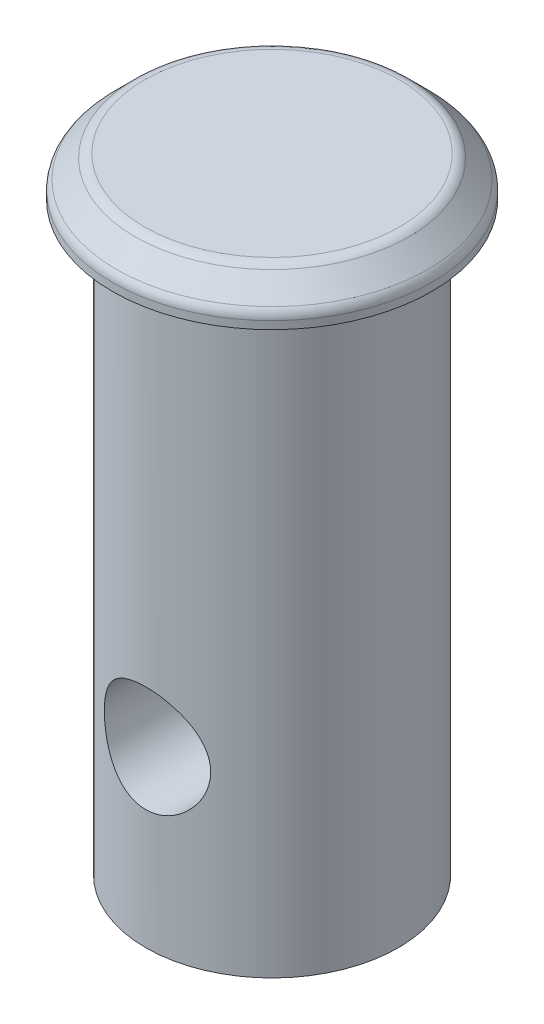
ISO-10303-21;
HEADER;
FILE_DESCRIPTION(('STEP AP214'),'2;1');
FILE_NAME('part.step','',(''),(''),'','','');
FILE_SCHEMA(('AUTOMOTIVE_DESIGN { 1 0 10303 214 1 1 1 1 }'));
ENDSEC;
DATA;
#1=APPLICATION_CONTEXT('core data for automotive mechanical design processes');
#2=APPLICATION_PROTOCOL_DEFINITION('international standard','automotive_design',2000,#1);
#3=PRODUCT_CONTEXT('',#1,'mechanical');
#4=PRODUCT('Part','Part','',(#3));
#5=PRODUCT_RELATED_PRODUCT_CATEGORY('part','',(#4));
#6=PRODUCT_DEFINITION_FORMATION('','',#4);
#7=PRODUCT_DEFINITION_CONTEXT('part definition',#1,'design');
#8=PRODUCT_DEFINITION('design','',#6,#7);
#9=PRODUCT_DEFINITION_SHAPE('','',#8);
#10=(LENGTH_UNIT() NAMED_UNIT(*) SI_UNIT(.MILLI.,.METRE.));
#11=(NAMED_UNIT(*) PLANE_ANGLE_UNIT() SI_UNIT($,.RADIAN.));
#12=(NAMED_UNIT(*) SI_UNIT($,.STERADIAN.) SOLID_ANGLE_UNIT());
#13=UNCERTAINTY_MEASURE_WITH_UNIT(LENGTH_MEASURE(1.E-05),#10,'distance_accuracy_value','');
#14=(GEOMETRIC_REPRESENTATION_CONTEXT(3) GLOBAL_UNCERTAINTY_ASSIGNED_CONTEXT((#13)) GLOBAL_UNIT_ASSIGNED_CONTEXT((#10,
#11,#12)) REPRESENTATION_CONTEXT('',''));
#15=CARTESIAN_POINT('',(0.,0.,0.));
#16=DIRECTION('',(0.,0.,1.));
#17=DIRECTION('',(1.,0.,0.));
#18=AXIS2_PLACEMENT_3D('',#15,#16,#17);
#19=CARTESIAN_POINT('',(0.,22.,0.));
#20=DIRECTION('',(0.,-1.,0.));
#21=DIRECTION('',(0.,0.,-1.));
#22=AXIS2_PLACEMENT_3D('',#19,#20,#21);
#23=CYLINDRICAL_SURFACE('',#22,4.75);
#24=CARTESIAN_POINT('',(0.,8.49999999999999,-4.75));
#25=CARTESIAN_POINT('',(-0.107036462368458,8.49998814532996,-4.74999105230106));
#26=CARTESIAN_POINT('',(-0.21423624616739,8.49135658953153,-4.7463402994097));
#27=CARTESIAN_POINT('',(-0.425593131869901,8.45713915107354,-4.73208882609393));
#28=CARTESIAN_POINT('',(-0.52974166164922,8.43150954401705,-4.7214701827862));
#29=CARTESIAN_POINT('',(-0.731590406184852,8.36441479455371,-4.69442284735135));
#30=CARTESIAN_POINT('',(-0.829311330167873,8.32300375832254,-4.67801402078023));
#31=CARTESIAN_POINT('',(-1.01632284675021,8.22574735712307,-4.64097919078582));
#32=CARTESIAN_POINT('',(-1.10561588355067,8.16990619475583,-4.62035441557184));
#33=CARTESIAN_POINT('',(-1.27793883653739,8.04236569927951,-4.57576887526126));
#34=CARTESIAN_POINT('',(-1.36048223127562,7.9700480867997,-4.55169736788395));
#35=CARTESIAN_POINT('',(-1.51268912853782,7.81291550367001,-4.50340541179333));
#36=CARTESIAN_POINT('',(-1.58234571599153,7.72809386696032,-4.4791848902796));
#37=CARTESIAN_POINT('',(-1.71027969557345,7.54317183626799,-4.43196710928289));
#38=CARTESIAN_POINT('',(-1.76780496391063,7.44251624240369,-4.40909335958272));
#39=CARTESIAN_POINT('',(-1.86489069620241,7.23185595603349,-4.36892020968375));
#40=CARTESIAN_POINT('',(-1.90446060785823,7.12185621646436,-4.35161787932547));
#41=CARTESIAN_POINT('',(-1.9624924807831,6.90123073507625,-4.32574780180008));
#42=CARTESIAN_POINT('',(-1.98189190257055,6.79089857234022,-4.31679434717452));
#43=CARTESIAN_POINT('',(-2.00195562895774,6.56820985617652,-4.30752932662971));
#44=CARTESIAN_POINT('',(-2.00263058226538,6.4558544897403,-4.30721284881607));
#45=CARTESIAN_POINT('',(-1.98593120072107,6.24173912670587,-4.31493181644961));
#46=CARTESIAN_POINT('',(-1.96997131078922,6.13984043764613,-4.32231278335099));
#47=CARTESIAN_POINT('',(-1.92283162811082,5.94033062141337,-4.34348696653289));
#48=CARTESIAN_POINT('',(-1.89164884741754,5.84272034006981,-4.35728144163054));
#49=CARTESIAN_POINT('',(-1.81433790634178,5.65206631520604,-4.39004171904363));
#50=CARTESIAN_POINT('',(-1.76790298398402,5.55916577634437,-4.40911227810592));
#51=CARTESIAN_POINT('',(-1.66162325591989,5.38210894402194,-4.45025281005121));
#52=CARTESIAN_POINT('',(-1.60177309979156,5.29795615909967,-4.47232397828682));
#53=CARTESIAN_POINT('',(-1.46428805277278,5.13312431231092,-4.51930009875198));
#54=CARTESIAN_POINT('',(-1.38556278942612,5.05337491080589,-4.54428505688558));
#55=CARTESIAN_POINT('',(-1.21561328405725,4.90789459181168,-4.59266646060081));
#56=CARTESIAN_POINT('',(-1.12438599890452,4.84216709739953,-4.61606251734623));
#57=CARTESIAN_POINT('',(-0.929145948219354,4.72519347993009,-4.65933566537717));
#58=CARTESIAN_POINT('',(-0.824878687890046,4.6743331679441,-4.67911472030857));
#59=CARTESIAN_POINT('',(-0.608222262411322,4.59120278922678,-4.7121696275971));
#60=CARTESIAN_POINT('',(-0.495837723966099,4.55892222502419,-4.72544915152312));
#61=CARTESIAN_POINT('',(-0.273899430083202,4.51583120013135,-4.7433183819797));
#62=CARTESIAN_POINT('',(-0.164628362907149,4.50377359370965,-4.74841197266554));
#63=CARTESIAN_POINT('',(0.0544859422097754,4.49774311229967,-4.7509495140171));
#64=CARTESIAN_POINT('',(0.164329001896026,4.50376490464474,-4.74839572034202));
#65=CARTESIAN_POINT('',(0.375578198064441,4.53283628486944,-4.73625128095379));
#66=CARTESIAN_POINT('',(0.477129162603386,4.55500337139975,-4.72702550402368));
#67=CARTESIAN_POINT('',(0.674955484098693,4.61450045081347,-4.70285789767311));
#68=CARTESIAN_POINT('',(0.771230176352193,4.65183234919367,-4.68791534993975));
#69=CARTESIAN_POINT('',(0.959158229909815,4.74181680892214,-4.65316408364171));
#70=CARTESIAN_POINT('',(1.05057430517146,4.79491027979358,-4.63321831478799));
#71=CARTESIAN_POINT('',(1.22352777344185,4.91442721179329,-4.59058023824968));
#72=CARTESIAN_POINT('',(1.30506098197807,4.98085628790685,-4.56788677524527));
#73=CARTESIAN_POINT('',(1.46218525430955,5.13082131505756,-4.52014832220439));
#74=CARTESIAN_POINT('',(1.53690971771378,5.21525137468509,-4.49505251450344));
#75=CARTESIAN_POINT('',(1.67137911518237,5.39584034625867,-4.44680874465642));
#76=CARTESIAN_POINT('',(1.73112037565901,5.49200212601888,-4.42366126112371));
#77=CARTESIAN_POINT('',(1.83465029067007,5.69546308089483,-4.38175075287145));
#78=CARTESIAN_POINT('',(1.87817619877721,5.80291229910873,-4.3630615717636));
#79=CARTESIAN_POINT('',(1.94613970779112,6.0246509697204,-4.33317944385815));
#80=CARTESIAN_POINT('',(1.97059349891389,6.13893453154197,-4.32198014009814));
#81=CARTESIAN_POINT('',(1.99809365532078,6.36146092798629,-4.30933055153168));
#82=CARTESIAN_POINT('',(2.00266563478006,6.46947653911539,-4.30718588214918));
#83=CARTESIAN_POINT('',(1.99436289136938,6.68467586246911,-4.31103684419065));
#84=CARTESIAN_POINT('',(1.98149098638983,6.79185970624488,-4.31703116084065));
#85=CARTESIAN_POINT('',(1.93995635081153,6.9969853911048,-4.33584430782861));
#86=CARTESIAN_POINT('',(1.91209039204409,7.09512330267604,-4.34831777145251));
#87=CARTESIAN_POINT('',(1.84214689268935,7.28534850569736,-4.37840569203651));
#88=CARTESIAN_POINT('',(1.80006534139776,7.37743408080827,-4.39602159966499));
#89=CARTESIAN_POINT('',(1.69994007024286,7.55905754412959,-4.43573763071445));
#90=CARTESIAN_POINT('',(1.64108110570075,7.64809973885387,-4.45804534068644));
#91=CARTESIAN_POINT('',(1.51020038304186,7.81552056147997,-4.5040651794814));
#92=CARTESIAN_POINT('',(1.43817390715273,7.89389534975474,-4.52777780960673));
#93=CARTESIAN_POINT('',(1.27659022248804,8.0438109838857,-4.57607254723289));
#94=CARTESIAN_POINT('',(1.18612311549111,8.11439775622011,-4.60058638516999));
#95=CARTESIAN_POINT('',(0.993725379452201,8.23944489543996,-4.64594055900097));
#96=CARTESIAN_POINT('',(0.891789570387905,8.29389793459625,-4.66677922394583));
#97=CARTESIAN_POINT('',(0.680840837781727,8.38398688603275,-4.70215008458216));
#98=CARTESIAN_POINT('',(0.57196575696476,8.41990747255066,-4.71677703656465));
#99=CARTESIAN_POINT('',(0.349166725075994,8.47258727529129,-4.73846042696525));
#100=CARTESIAN_POINT('',(0.23525968681136,8.48940625744335,-4.74554047417122));
#101=CARTESIAN_POINT('',(0.0806138559737825,8.49878589900155,-4.74949001252044));
#102=CARTESIAN_POINT('',(0.0403185146594553,8.50000446541932,-4.75000337042091));
#103=CARTESIAN_POINT('',(0.,8.49999999999999,-4.75));
#104=B_SPLINE_CURVE_WITH_KNOTS('',3,(#24,#25,#26,#27,#28,#29,#30,#31,#32,#33,#34,#35,#36,#37,
#38,#39,#40,#41,#42,#43,#44,#45,#46,#47,#48,#49,#50,#51,#52,#53,#54,#55,#56,#57,#58,#59,#60,#61,
#62,#63,#64,#65,#66,#67,#68,#69,#70,#71,#72,#73,#74,#75,#76,#77,#78,#79,#80,#81,#82,#83,#84,#85,
#86,#87,#88,#89,#90,#91,#92,#93,#94,#95,#96,#97,#98,#99,#100,#101,#102,#103),.UNSPECIFIED.,.T.,
.F.,(4,2,2,2,2,2,2,2,2,2,2,2,2,2,2,2,2,2,2,2,2,2,2,2,2,2,2,2,2,2,2,2,2,2,2,2,2,2,2,4),(0.,
0.320992833427258,0.642814581763422,0.963542757751974,1.2841776305755,1.61977067727506,
1.95554328441993,2.30826935782324,2.66080961894182,2.99611267136669,3.33122503119564,
3.63999866694788,3.94883293312584,4.26430374352242,4.57990059829875,4.92278837411684,
5.26575976135261,5.61697022291762,5.96798205692134,6.29642217319481,6.62476542288596,
6.93639255342285,7.24805885281148,7.56943103565564,7.89093881783371,8.23588662956777,
8.58091893324743,8.93132109614982,9.28142547982678,9.60412990992076,9.92678221645595,
10.2337737894146,10.5408520476219,10.8666093059307,11.1924835089913,11.5428100141678,
11.8932953899746,12.2382234684013,12.5820693217041,12.7029809622212),.UNSPECIFIED.);
#105=CARTESIAN_POINT('',(0.,8.49999999999999,-4.75));
#106=VERTEX_POINT('',#105);
#107=EDGE_CURVE('E49',#106,#106,#104,.T.);
#108=ORIENTED_EDGE('',*,*,#107,.T.);
#109=EDGE_LOOP('',(#108));
#110=FACE_BOUND('',#109,.T.);
#111=CARTESIAN_POINT('',(2.,6.5,4.30842198490352));
#112=CARTESIAN_POINT('',(1.99999131934848,6.39343248723242,4.30843054464486));
#113=CARTESIAN_POINT('',(1.99143079107255,6.28670958703551,4.31243212963685));
#114=CARTESIAN_POINT('',(1.9575309488105,6.0763434565313,4.32792093407999));
#115=CARTESIAN_POINT('',(1.93214651737775,5.97270929250239,4.33942828076367));
#116=CARTESIAN_POINT('',(1.86576551208753,5.77195631906481,4.36837651337226));
#117=CARTESIAN_POINT('',(1.8248334955727,5.67481249552162,4.38579283230239));
#118=CARTESIAN_POINT('',(1.72871004996954,5.48879749532912,4.42456063901514));
#119=CARTESIAN_POINT('',(1.67352178389854,5.39992448958523,4.44591125359938));
#120=CARTESIAN_POINT('',(1.5467015963202,5.2272718600189,4.49165970324772));
#121=CARTESIAN_POINT('',(1.47430503116527,5.14408137252741,4.51616225633892));
#122=CARTESIAN_POINT('',(1.31672831441459,4.99058568562705,4.56459392696584));
#123=CARTESIAN_POINT('',(1.23154319627829,4.92028551594618,4.58852281750948));
#124=CARTESIAN_POINT('',(1.04615829588292,4.79153881326608,4.63438842840327));
#125=CARTESIAN_POINT('',(0.945459368167892,4.73375820165371,4.65618928890282));
#126=CARTESIAN_POINT('',(0.734686551915896,4.63621291390597,4.69405721652876));
#127=CARTESIAN_POINT('',(0.62461693543968,4.59644007979519,4.71012687932976));
#128=CARTESIAN_POINT('',(0.404415522796755,4.53818404223046,4.73397861503267));
#129=CARTESIAN_POINT('',(0.294596284647782,4.51868409825426,4.74215483370298));
#130=CARTESIAN_POINT('',(0.0729606495985208,4.49823896171761,4.75073207786679));
#131=CARTESIAN_POINT('',(-0.0388548997969266,4.49728607433246,4.75113632780298));
#132=CARTESIAN_POINT('',(-0.253904507534079,4.51343600786325,4.74435401811761));
#133=CARTESIAN_POINT('',(-0.357240149333749,4.52942083673989,4.73763746002986));
#134=CARTESIAN_POINT('',(-0.559603082118503,4.57707194104371,4.71801685316286));
#135=CARTESIAN_POINT('',(-0.658630054585297,4.60873937367166,4.70511234778455));
#136=CARTESIAN_POINT('',(-0.851387128927116,4.68722893762615,4.67411206487987));
#137=CARTESIAN_POINT('',(-0.945013153905917,4.73427527326941,4.65593996608066));
#138=CARTESIAN_POINT('',(-1.12328732884621,4.8419646417334,4.61617592633721));
#139=CARTESIAN_POINT('',(-1.20793226914312,4.9026125115281,4.59458276960119));
#140=CARTESIAN_POINT('',(-1.37229770971299,5.04084231240864,4.54830782988722));
#141=CARTESIAN_POINT('',(-1.45122884715761,5.11932717681206,4.52351560106454));
#142=CARTESIAN_POINT('',(-1.59515452572048,5.28846365917425,4.47479248215149));
#143=CARTESIAN_POINT('',(-1.66014345921645,5.37912014887499,4.45086194184458));
#144=CARTESIAN_POINT('',(-1.7764273686949,5.57393214609276,4.40577320225433));
#145=CARTESIAN_POINT('',(-1.82717867740344,5.67844301091663,4.38473764193727));
#146=CARTESIAN_POINT('',(-1.91003748440372,5.89564836925829,4.34928865313087));
#147=CARTESIAN_POINT('',(-1.94215864184886,6.00833679881616,4.33487037464151));
#148=CARTESIAN_POINT('',(-1.98481471902991,6.23078239635833,4.31549852286991));
#149=CARTESIAN_POINT('',(-1.9966317594255,6.34024397916771,4.30998424080262));
#150=CARTESIAN_POINT('',(-2.00211667986055,6.55970140230046,4.30744060160681));
#151=CARTESIAN_POINT('',(-1.99579106337395,6.66969703707429,4.31040820403393));
#152=CARTESIAN_POINT('',(-1.96634091191023,6.87944816144005,4.32391366279904));
#153=CARTESIAN_POINT('',(-1.9443524158464,6.97940041884288,4.33393906571426));
#154=CARTESIAN_POINT('',(-1.88571462232035,7.17411008644227,4.35977052749396));
#155=CARTESIAN_POINT('',(-1.84906184951785,7.26886625914256,4.37557795658566));
#156=CARTESIAN_POINT('',(-1.76039932389396,7.45502729835321,4.41201518341638));
#157=CARTESIAN_POINT('',(-1.70779965559225,7.54611535831042,4.43282235903574));
#158=CARTESIAN_POINT('',(-1.58931916192501,7.71861586441352,4.47666738500819));
#159=CARTESIAN_POINT('',(-1.52343250299735,7.80002403562791,4.49970621283596));
#160=CARTESIAN_POINT('',(-1.37376869985395,7.95792816246956,4.54773889674336));
#161=CARTESIAN_POINT('',(-1.2889572905915,8.03344691998355,4.57273542348659));
#162=CARTESIAN_POINT('',(-1.10729218870919,8.16936253933542,4.62008723507347));
#163=CARTESIAN_POINT('',(-1.01043749999861,8.22975814910223,4.64244230114524));
#164=CARTESIAN_POINT('',(-0.806650096429426,8.33369421616988,4.682159175267));
#165=CARTESIAN_POINT('',(-0.699684318987701,8.3771768200203,4.69950379318314));
#166=CARTESIAN_POINT('',(-0.479036335100373,8.44520694447396,4.72708719511963));
#167=CARTESIAN_POINT('',(-0.365358265548637,8.46976599949171,4.73733030731735));
#168=CARTESIAN_POINT('',(-0.143237353681146,8.49777702560529,4.74904919006876));
#169=CARTESIAN_POINT('',(-0.0349971697480154,8.50260590806438,4.75109668232659));
#170=CARTESIAN_POINT('',(0.180716748799997,8.4947389364945,4.74778566283004));
#171=CARTESIAN_POINT('',(0.288190619283815,8.48204627085582,4.74242849849833));
#172=CARTESIAN_POINT('',(0.495239451900787,8.44048508958961,4.72521382558719));
#173=CARTESIAN_POINT('',(0.594959548485699,8.41222897255519,4.71360275973926));
#174=CARTESIAN_POINT('',(0.788200583199375,8.34101869479664,4.68516673707061));
#175=CARTESIAN_POINT('',(0.881720352860748,8.29806177301393,4.66834080086551));
#176=CARTESIAN_POINT('',(1.064584614925,8.19649380460099,4.63014910919753));
#177=CARTESIAN_POINT('',(1.15354705854381,8.13726085053888,4.6086119906344));
#178=CARTESIAN_POINT('',(1.32065163159127,8.00572194448435,4.56353829444643));
#179=CARTESIAN_POINT('',(1.3987896230298,7.93341101724301,4.54000095769205));
#180=CARTESIAN_POINT('',(1.54769821595443,7.77181783560334,4.4915126365084));
#181=CARTESIAN_POINT('',(1.61757515170057,7.68170376247978,4.46657752434327));
#182=CARTESIAN_POINT('',(1.74135517953708,7.49029693831215,4.41979333465504));
#183=CARTESIAN_POINT('',(1.79524922073293,7.38899789775884,4.39794600935449));
#184=CARTESIAN_POINT('',(1.88502336126085,7.17803569814751,4.36022694521342));
#185=CARTESIAN_POINT('',(1.92097711385374,7.06840890237951,4.3443308421422));
#186=CARTESIAN_POINT('',(1.9603932149606,6.90022935437953,4.32660944209334));
#187=CARTESIAN_POINT('',(1.9711094684443,6.84360262314387,4.32172453578694));
#188=CARTESIAN_POINT('',(1.98762169826053,6.72950082763149,4.31415686352989));
#189=CARTESIAN_POINT('',(1.99342108632849,6.67202637979171,4.31147257065106));
#190=CARTESIAN_POINT('',(1.99890914769187,6.57631830434142,4.30892809699833));
#191=CARTESIAN_POINT('',(2.00000310913535,6.53816911907988,4.30841891907438));
#192=CARTESIAN_POINT('',(2.,6.5,4.30842198490352));
#193=B_SPLINE_CURVE_WITH_KNOTS('',3,(#111,#112,#113,#114,#115,#116,#117,#118,#119,#120,#121,
#122,#123,#124,#125,#126,#127,#128,#129,#130,#131,#132,#133,#134,#135,#136,#137,#138,#139,#140,
#141,#142,#143,#144,#145,#146,#147,#148,#149,#150,#151,#152,#153,#154,#155,#156,#157,#158,#159,
#160,#161,#162,#163,#164,#165,#166,#167,#168,#169,#170,#171,#172,#173,#174,#175,#176,#177,#178,
#179,#180,#181,#182,#183,#184,#185,#186,#187,#188,#189,#190,#191,#192),.UNSPECIFIED.,.T.,.F.,(4,
2,2,2,2,2,2,2,2,2,2,2,2,2,2,2,2,2,2,2,2,2,2,2,2,2,2,2,2,2,2,2,2,2,2,2,2,2,2,2,4),(0.,
0.3195673434676,0.639995172162606,0.959106799139381,1.27814768591402,1.61558401305247,
1.95315172701683,2.30572671230962,2.65814181207011,2.99187659997614,3.32547292464746,
3.63834534304787,3.95124085137407,4.26891815696387,4.58670861451657,4.92730569009794,
5.26803949971278,5.62041363560371,5.97252909208191,6.30145873189971,6.63027047730072,
6.9373851990156,7.24457274812027,7.56490236261953,7.88537292302805,8.23259290369929,
8.57984162180395,8.92826792359706,9.27648168177331,9.59993054486148,9.92332055782565,
10.2348109826313,10.5463599427188,10.8720466326587,11.1978574851006,11.5463872959705,
11.8951140992724,12.2423971882221,12.4157051509404,12.5888927593436,12.703351694061),.UNSPECIFIED.);
#194=CARTESIAN_POINT('',(2.,6.5,4.30842198490352));
#195=VERTEX_POINT('',#194);
#196=EDGE_CURVE('E68',#195,#195,#193,.T.);
#197=ORIENTED_EDGE('',*,*,#196,.T.);
#198=EDGE_LOOP('',(#197));
#199=FACE_BOUND('',#198,.T.);
#200=CARTESIAN_POINT('',(0.,22.,0.));
#201=DIRECTION('',(0.,1.,0.));
#202=DIRECTION('',(0.,0.,1.));
#203=AXIS2_PLACEMENT_3D('',#200,#201,#202);
#204=CIRCLE('',#203,4.75);
#205=CARTESIAN_POINT('',(0.,22.,4.75));
#206=VERTEX_POINT('',#205);
#207=EDGE_CURVE('E106',#206,#206,#204,.T.);
#208=ORIENTED_EDGE('',*,*,#207,.F.);
#209=EDGE_LOOP('',(#208));
#210=FACE_BOUND('',#209,.T.);
#211=CARTESIAN_POINT('',(0.,0.,0.));
#212=DIRECTION('',(0.,1.,0.));
#213=DIRECTION('',(0.,0.,1.));
#214=AXIS2_PLACEMENT_3D('',#211,#212,#213);
#215=CIRCLE('',#214,4.75);
#216=CARTESIAN_POINT('',(0.,0.,4.75));
#217=VERTEX_POINT('',#216);
#218=EDGE_CURVE('E103',#217,#217,#215,.T.);
#219=ORIENTED_EDGE('',*,*,#218,.T.);
#220=EDGE_LOOP('',(#219));
#221=FACE_BOUND('',#220,.T.);
#222=ADVANCED_FACE('F45',(#110,#199,#210,#221),#23,.T.);
#223=CARTESIAN_POINT('',(0.,0.,0.));
#224=DIRECTION('',(0.,1.,0.));
#225=DIRECTION('',(0.,0.,1.));
#226=AXIS2_PLACEMENT_3D('',#223,#224,#225);
#227=PLANE('',#226);
#228=ORIENTED_EDGE('',*,*,#218,.F.);
#229=EDGE_LOOP('',(#228));
#230=FACE_BOUND('',#229,.T.);
#231=ADVANCED_FACE('F93',(#230),#227,.F.);
#232=CARTESIAN_POINT('',(0.,23.5,0.));
#233=DIRECTION('',(0.,-1.,0.));
#234=DIRECTION('',(0.,0.,-1.));
#235=AXIS2_PLACEMENT_3D('',#232,#233,#234);
#236=CYLINDRICAL_SURFACE('',#235,6.);
#237=CARTESIAN_POINT('',(0.,22.2928932188134,0.));
#238=DIRECTION('',(0.,1.,0.));
#239=DIRECTION('',(0.,0.,1.));
#240=AXIS2_PLACEMENT_3D('',#237,#238,#239);
#241=CIRCLE('',#240,6.);
#242=CARTESIAN_POINT('',(0.,22.2928932188134,6.));
#243=VERTEX_POINT('',#242);
#244=EDGE_CURVE('E112',#243,#243,#241,.F.);
#245=ORIENTED_EDGE('',*,*,#244,.T.);
#246=EDGE_LOOP('',(#245));
#247=FACE_BOUND('',#246,.T.);
#248=CARTESIAN_POINT('',(0.,22.,0.));
#249=DIRECTION('',(0.,1.,0.));
#250=DIRECTION('',(0.,0.,1.));
#251=AXIS2_PLACEMENT_3D('',#248,#249,#250);
#252=CIRCLE('',#251,6.);
#253=CARTESIAN_POINT('',(0.,22.,6.));
#254=VERTEX_POINT('',#253);
#255=EDGE_CURVE('E107',#254,#254,#252,.T.);
#256=ORIENTED_EDGE('',*,*,#255,.T.);
#257=EDGE_LOOP('',(#256));
#258=FACE_BOUND('',#257,.T.);
#259=ADVANCED_FACE('F87',(#247,#258),#236,.T.);
#260=CARTESIAN_POINT('',(0.,23.5,0.));
#261=DIRECTION('',(0.,1.,0.));
#262=DIRECTION('',(0.,0.,1.));
#263=AXIS2_PLACEMENT_3D('',#260,#261,#262);
#264=PLANE('',#263);
#265=CARTESIAN_POINT('',(0.,23.5,0.));
#266=DIRECTION('',(0.,1.,0.));
#267=DIRECTION('',(0.,0.,1.));
#268=AXIS2_PLACEMENT_3D('',#265,#266,#267);
#269=CIRCLE('',#268,4.79289321881345);
#270=CARTESIAN_POINT('',(0.,23.5,4.79289321881345));
#271=VERTEX_POINT('',#270);
#272=EDGE_CURVE('E10',#271,#271,#269,.T.);
#273=ORIENTED_EDGE('',*,*,#272,.T.);
#274=EDGE_LOOP('',(#273));
#275=FACE_BOUND('',#274,.T.);
#276=ADVANCED_FACE('F82',(#275),#264,.T.);
#277=CARTESIAN_POINT('',(0.,22.,0.));
#278=DIRECTION('',(0.,1.,0.));
#279=DIRECTION('',(0.,0.,1.));
#280=AXIS2_PLACEMENT_3D('',#277,#278,#279);
#281=PLANE('',#280);
#282=ORIENTED_EDGE('',*,*,#207,.T.);
#283=EDGE_LOOP('',(#282));
#284=FACE_BOUND('',#283,.T.);
#285=ORIENTED_EDGE('',*,*,#255,.F.);
#286=EDGE_LOOP('',(#285));
#287=FACE_BOUND('',#286,.T.);
#288=ADVANCED_FACE('F86',(#284,#287),#281,.F.);
#289=CARTESIAN_POINT('',(0.,23.5,0.));
#290=DIRECTION('',(0.,-1.,0.));
#291=DIRECTION('',(0.,0.,-1.));
#292=AXIS2_PLACEMENT_3D('',#289,#290,#291);
#293=CONICAL_SURFACE('',#292,5.,0.785398163397448);
#294=CARTESIAN_POINT('',(0.,22.6464466094067,0.));
#295=DIRECTION('',(0.,-1.,0.));
#296=DIRECTION('',(0.,0.,-1.));
#297=AXIS2_PLACEMENT_3D('',#294,#295,#296);
#298=CIRCLE('',#297,5.85355339059328);
#299=CARTESIAN_POINT('',(0.,22.6464466094067,-5.85355339059328));
#300=VERTEX_POINT('',#299);
#301=EDGE_CURVE('E59',#300,#300,#298,.F.);
#302=ORIENTED_EDGE('',*,*,#301,.T.);
#303=EDGE_LOOP('',(#302));
#304=FACE_BOUND('',#303,.T.);
#305=CARTESIAN_POINT('',(0.,23.3535533905933,0.));
#306=DIRECTION('',(0.,1.,0.));
#307=DIRECTION('',(0.,0.,1.));
#308=AXIS2_PLACEMENT_3D('',#305,#306,#307);
#309=CIRCLE('',#308,5.14644660940672);
#310=CARTESIAN_POINT('',(0.,23.3535533905933,5.14644660940672));
#311=VERTEX_POINT('',#310);
#312=EDGE_CURVE('E65',#311,#311,#309,.F.);
#313=ORIENTED_EDGE('',*,*,#312,.T.);
#314=EDGE_LOOP('',(#313));
#315=FACE_BOUND('',#314,.T.);
#316=ADVANCED_FACE('F90',(#304,#315),#293,.T.);
#317=CARTESIAN_POINT('',(0.,22.2928932188134,0.));
#318=DIRECTION('',(0.,1.,0.));
#319=DIRECTION('',(0.,0.,1.));
#320=AXIS2_PLACEMENT_3D('',#317,#318,#319);
#321=TOROIDAL_SURFACE('',#320,5.5,0.5);
#322=ORIENTED_EDGE('',*,*,#301,.F.);
#323=EDGE_LOOP('',(#322));
#324=FACE_BOUND('',#323,.T.);
#325=ORIENTED_EDGE('',*,*,#244,.F.);
#326=EDGE_LOOP('',(#325));
#327=FACE_BOUND('',#326,.T.);
#328=ADVANCED_FACE('F126',(#324,#327),#321,.T.);
#329=CARTESIAN_POINT('',(0.,23.,0.));
#330=DIRECTION('',(0.,1.,0.));
#331=DIRECTION('',(0.,0.,1.));
#332=AXIS2_PLACEMENT_3D('',#329,#330,#331);
#333=TOROIDAL_SURFACE('',#332,4.79289321881345,0.5);
#334=ORIENTED_EDGE('',*,*,#312,.F.);
#335=EDGE_LOOP('',(#334));
#336=FACE_BOUND('',#335,.T.);
#337=ORIENTED_EDGE('',*,*,#272,.F.);
#338=EDGE_LOOP('',(#337));
#339=FACE_BOUND('',#338,.T.);
#340=ADVANCED_FACE('F47',(#336,#339),#333,.T.);
#341=CARTESIAN_POINT('',(0.,6.5,-6.));
#342=DIRECTION('',(0.,0.,1.));
#343=DIRECTION('',(1.,0.,0.));
#344=AXIS2_PLACEMENT_3D('',#341,#342,#343);
#345=CYLINDRICAL_SURFACE('',#344,2.);
#346=ORIENTED_EDGE('',*,*,#196,.F.);
#347=EDGE_LOOP('',(#346));
#348=FACE_BOUND('',#347,.T.);
#349=ORIENTED_EDGE('',*,*,#107,.F.);
#350=EDGE_LOOP('',(#349));
#351=FACE_BOUND('',#350,.T.);
#352=ADVANCED_FACE('F77',(#348,#351),#345,.F.);
#353=CLOSED_SHELL('',(#222,#231,#259,#276,#288,#316,#328,#340,#352));
#354=MANIFOLD_SOLID_BREP('B2',#353);
#355=ADVANCED_BREP_SHAPE_REPRESENTATION('',(#18,#354),#14);
#356=SHAPE_DEFINITION_REPRESENTATION(#9,#355);
ENDSEC;
END-ISO-10303-21;
